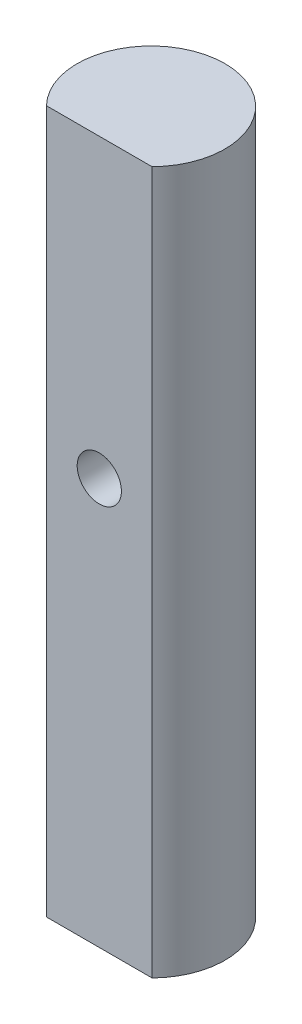
ISO-10303-21;
HEADER;
FILE_DESCRIPTION(('STEP AP214'),'2;1');
FILE_NAME('part.step','',(''),(''),'','','');
FILE_SCHEMA(('AUTOMOTIVE_DESIGN { 1 0 10303 214 1 1 1 1 }'));
ENDSEC;
DATA;
#1=APPLICATION_CONTEXT('core data for automotive mechanical design processes');
#2=APPLICATION_PROTOCOL_DEFINITION('international standard','automotive_design',2000,#1);
#3=PRODUCT_CONTEXT('',#1,'mechanical');
#4=PRODUCT('Part','Part','',(#3));
#5=PRODUCT_RELATED_PRODUCT_CATEGORY('part','',(#4));
#6=PRODUCT_DEFINITION_FORMATION('','',#4);
#7=PRODUCT_DEFINITION_CONTEXT('part definition',#1,'design');
#8=PRODUCT_DEFINITION('design','',#6,#7);
#9=PRODUCT_DEFINITION_SHAPE('','',#8);
#10=(LENGTH_UNIT() NAMED_UNIT(*) SI_UNIT(.MILLI.,.METRE.));
#11=(NAMED_UNIT(*) PLANE_ANGLE_UNIT() SI_UNIT($,.RADIAN.));
#12=(NAMED_UNIT(*) SI_UNIT($,.STERADIAN.) SOLID_ANGLE_UNIT());
#13=UNCERTAINTY_MEASURE_WITH_UNIT(LENGTH_MEASURE(1.E-05),#10,'distance_accuracy_value','');
#14=(GEOMETRIC_REPRESENTATION_CONTEXT(3) GLOBAL_UNCERTAINTY_ASSIGNED_CONTEXT((#13)) GLOBAL_UNIT_ASSIGNED_CONTEXT((#10,
#11,#12)) REPRESENTATION_CONTEXT('',''));
#15=CARTESIAN_POINT('',(0.,0.,0.));
#16=DIRECTION('',(0.,0.,1.));
#17=DIRECTION('',(1.,0.,0.));
#18=AXIS2_PLACEMENT_3D('',#15,#16,#17);
#19=CARTESIAN_POINT('',(0.,60.32492963,0.));
#20=DIRECTION('',(0.,-1.,0.));
#21=DIRECTION('',(0.,0.,-1.));
#22=AXIS2_PLACEMENT_3D('',#19,#20,#21);
#23=CYLINDRICAL_SURFACE('',#22,6.35);
#24=CARTESIAN_POINT('',(0.,32.979404704,-6.3500000000003));
#25=CARTESIAN_POINT('',(0.10417423007137,32.9794060100568,-6.34999907745002));
#26=CARTESIAN_POINT('',(0.208361677234869,32.9880068124391,-6.34741194322595));
#27=CARTESIAN_POINT('',(0.413703564897641,33.0221017775473,-6.33734405929361));
#28=CARTESIAN_POINT('',(0.514857073747792,33.0476010749863,-6.32986182218663));
#29=CARTESIAN_POINT('',(0.711139592873179,33.1145662800004,-6.31082376723533));
#30=CARTESIAN_POINT('',(0.806277218635493,33.1560087230154,-6.29927393803215));
#31=CARTESIAN_POINT('',(0.988253187796907,33.2535878862995,-6.27330179744045));
#32=CARTESIAN_POINT('',(1.07509044153309,33.3097265322616,-6.25887910967084));
#33=CARTESIAN_POINT('',(1.24047891030717,33.4367927285918,-6.22823999433316));
#34=CARTESIAN_POINT('',(1.3187597983693,33.508063294062,-6.21198699198934));
#35=CARTESIAN_POINT('',(1.46245535318964,33.6626390721746,-6.17973775823127));
#36=CARTESIAN_POINT('',(1.52786787234963,33.7459462895933,-6.16374157008507));
#37=CARTESIAN_POINT('',(1.64538908787594,33.9245138356212,-6.13343056671381));
#38=CARTESIAN_POINT('',(1.69716842823096,34.0199993678275,-6.11916122325647));
#39=CARTESIAN_POINT('',(1.78382461525216,34.218818135287,-6.09446589742613));
#40=CARTESIAN_POINT('',(1.81870549028692,34.3221494933993,-6.08403899920748));
#41=CARTESIAN_POINT('',(1.86960095013749,34.5306924475155,-6.06859017174986));
#42=CARTESIAN_POINT('',(1.88611365020934,34.6357716484882,-6.06342587458966));
#43=CARTESIAN_POINT('',(1.90135937321492,34.8473260572609,-6.05866338815991));
#44=CARTESIAN_POINT('',(1.90009667171744,34.9538009232016,-6.05906386037997));
#45=CARTESIAN_POINT('',(1.88021881579598,35.1610787639443,-6.06525944714982));
#46=CARTESIAN_POINT('',(1.86222702847388,35.2619482704934,-6.07086075515797));
#47=CARTESIAN_POINT('',(1.81040860261061,35.4591662213698,-6.08651344917327));
#48=CARTESIAN_POINT('',(1.77658041070945,35.5555142211715,-6.09656527171689));
#49=CARTESIAN_POINT('',(1.69358876358904,35.742482075175,-6.12014156612633));
#50=CARTESIAN_POINT('',(1.64422262512323,35.8330059855995,-6.13371149128894));
#51=CARTESIAN_POINT('',(1.53169729719298,36.0046941457619,-6.16277307320922));
#52=CARTESIAN_POINT('',(1.46853478416468,36.0858561329891,-6.17826519263676));
#53=CARTESIAN_POINT('',(1.3271108490196,36.2400530002879,-6.210212245628));
#54=CARTESIAN_POINT('',(1.24833191932304,36.3126112997898,-6.22668046499809));
#55=CARTESIAN_POINT('',(1.07951936513868,36.4435973878104,-6.25815467195813));
#56=CARTESIAN_POINT('',(0.989485042148457,36.5020242986834,-6.27316056869434));
#57=CARTESIAN_POINT('',(0.799855333702399,36.6033758932695,-6.30015487523226));
#58=CARTESIAN_POINT('',(0.700200638080896,36.646195466326,-6.31212266638949));
#59=CARTESIAN_POINT('',(0.494663437454937,36.7143261177821,-6.33154372644205));
#60=CARTESIAN_POINT('',(0.388782666341637,36.7396420459261,-6.33899824576079));
#61=CARTESIAN_POINT('',(0.177850894597567,36.7712547791772,-6.34835533637998));
#62=CARTESIAN_POINT('',(0.072904922643046,36.7781975534776,-6.35044639318698));
#63=CARTESIAN_POINT('',(-0.136659129006903,36.7746766210019,-6.34939358227364));
#64=CARTESIAN_POINT('',(-0.241277250313168,36.7642152209017,-6.34625040827613));
#65=CARTESIAN_POINT('',(-0.444781942193918,36.7267054746515,-6.33520564342841));
#66=CARTESIAN_POINT('',(-0.543744413662504,36.7000340452288,-6.32741225271153));
#67=CARTESIAN_POINT('',(-0.735768622856867,36.6313143310468,-6.30796848523179));
#68=CARTESIAN_POINT('',(-0.828829651453892,36.589264202446,-6.29631764599294));
#69=CARTESIAN_POINT('',(-1.00879032004296,36.489892852508,-6.27003255890797));
#70=CARTESIAN_POINT('',(-1.09549867740114,36.4322422046762,-6.25533577597258));
#71=CARTESIAN_POINT('',(-1.25823067273906,36.3037070377544,-6.22464652181085));
#72=CARTESIAN_POINT('',(-1.3342516416571,36.2328192230775,-6.20865372848617));
#73=CARTESIAN_POINT('',(-1.47629145056279,36.0767875055954,-6.17645243900758));
#74=CARTESIAN_POINT('',(-1.54185080419523,35.9912217303141,-6.16025695785637));
#75=CARTESIAN_POINT('',(-1.65771183079171,35.8099515483067,-6.13009694049586));
#76=CARTESIAN_POINT('',(-1.70801391463707,35.7142474147024,-6.11613234421318));
#77=CARTESIAN_POINT('',(-1.79158652861863,35.5157291279489,-6.09217616531609));
#78=CARTESIAN_POINT('',(-1.82493730082877,35.4129511379582,-6.08216591527265));
#79=CARTESIAN_POINT('',(-1.87375981206238,35.2028832044675,-6.06730484103379));
#80=CARTESIAN_POINT('',(-1.88923762630833,35.0955948069657,-6.06245226373115));
#81=CARTESIAN_POINT('',(-1.90146374813229,34.8843226866514,-6.05862786351896));
#82=CARTESIAN_POINT('',(-1.89896073312194,34.7803859757344,-6.05942095598867));
#83=CARTESIAN_POINT('',(-1.87708175514671,34.5744873211649,-6.06623379445759));
#84=CARTESIAN_POINT('',(-1.85770645947701,34.4725252995768,-6.07225333375188));
#85=CARTESIAN_POINT('',(-1.80311475679839,34.2746853061407,-6.08868365405119));
#86=CARTESIAN_POINT('',(-1.76809533443216,34.1787481001893,-6.0990397324944));
#87=CARTESIAN_POINT('',(-1.68336272312535,33.9940342510198,-6.12296653822527));
#88=CARTESIAN_POINT('',(-1.6336467363105,33.9052589753618,-6.13653787752392));
#89=CARTESIAN_POINT('',(-1.51882382377394,33.733911582476,-6.16597947053966));
#90=CARTESIAN_POINT('',(-1.45322474564031,33.6516805152098,-6.18191517730378));
#91=CARTESIAN_POINT('',(-1.30938518586601,33.4991508542522,-6.21397068703907));
#92=CARTESIAN_POINT('',(-1.23114143189495,33.428855359064,-6.23009053665855));
#93=CARTESIAN_POINT('',(-1.0615029927584,33.3001633808807,-6.26125794809995));
#94=CARTESIAN_POINT('',(-0.969792965367141,33.2421706579669,-6.27626091077484));
#95=CARTESIAN_POINT('',(-0.77747577803463,33.1425088992376,-6.30297006599699));
#96=CARTESIAN_POINT('',(-0.676872858099815,33.1008321351115,-6.3146778186319));
#97=CARTESIAN_POINT('',(-0.480946828717826,33.0387762401612,-6.3324396356006));
#98=CARTESIAN_POINT('',(-0.38624193432698,33.0165719658805,-6.33897056340221));
#99=CARTESIAN_POINT('',(-0.194361588258408,32.9868868001475,-6.34775082360896));
#100=CARTESIAN_POINT('',(-0.0971865458476243,32.9794034855494,-6.35000086066877));
#101=CARTESIAN_POINT('',(0.,32.979404704,-6.3500000000003));
#102=B_SPLINE_CURVE_WITH_KNOTS('',3,(#24,#25,#26,#27,#28,#29,#30,#31,#32,#33,#34,#35,#36,#37,
#38,#39,#40,#41,#42,#43,#44,#45,#46,#47,#48,#49,#50,#51,#52,#53,#54,#55,#56,#57,#58,#59,#60,#61,
#62,#63,#64,#65,#66,#67,#68,#69,#70,#71,#72,#73,#74,#75,#76,#77,#78,#79,#80,#81,#82,#83,#84,#85,
#86,#87,#88,#89,#90,#91,#92,#93,#94,#95,#96,#97,#98,#99,#100,#101),.UNSPECIFIED.,.T.,.F.,(4,2,2,
2,2,2,2,2,2,2,2,2,2,2,2,2,2,2,2,2,2,2,2,2,2,2,2,2,2,2,2,2,2,2,2,2,2,2,4),(0.,0.312165720584856,
0.624426338188596,0.936229129018963,1.24807279688995,1.56793135194628,1.88784324289997,
2.21489216211498,2.54186307882267,2.85973281175923,3.1775260878756,3.48393269114427,
3.7903693554985,4.10098164824079,4.41166885056055,4.73523962855109,5.05883049711224,
5.38456205379575,5.71020332365662,6.024233362758,6.33822178495756,6.64517465691199,
6.95216434329719,7.26622482669836,7.5803636045641,7.90582936913737,8.23128636807431,
8.55518806464502,8.87897963089215,9.18936986001778,9.49974781383185,9.80632319022189,
10.1129569688578,10.4306947974601,10.7485149858714,11.0755434088709,11.4024167417515,
11.6936913033873,11.9849179157164),.UNSPECIFIED.);
#103=CARTESIAN_POINT('',(0.,32.979404704,-6.3500000000003));
#104=VERTEX_POINT('',#103);
#105=EDGE_CURVE('E13',#104,#104,#102,.T.);
#106=ORIENTED_EDGE('',*,*,#105,.T.);
#107=EDGE_LOOP('',(#106));
#108=FACE_BOUND('',#107,.T.);
#109=CARTESIAN_POINT('',(0.,60.32492963,0.));
#110=DIRECTION('',(0.,1.,0.));
#111=DIRECTION('',(0.,0.,1.));
#112=AXIS2_PLACEMENT_3D('',#109,#110,#111);
#113=CIRCLE('',#112,6.35);
#114=CARTESIAN_POINT('',(4.53480705212471,60.32492963,4.44499999999959));
#115=VERTEX_POINT('',#114);
#116=CARTESIAN_POINT('',(-4.53480705212471,60.32492963,4.44499999999959));
#117=VERTEX_POINT('',#116);
#118=EDGE_CURVE('E86',#115,#117,#113,.T.);
#119=ORIENTED_EDGE('',*,*,#118,.F.);
#120=DIRECTION('',(0.,-1.,0.));
#121=VECTOR('',#120,1.);
#122=CARTESIAN_POINT('',(4.53480705212471,60.32492963,4.44499999999959));
#123=LINE('',#122,#121);
#124=CARTESIAN_POINT('',(4.53480705212471,0.,4.44499999999959));
#125=VERTEX_POINT('',#124);
#126=EDGE_CURVE('E73',#115,#125,#123,.T.);
#127=ORIENTED_EDGE('',*,*,#126,.T.);
#128=CARTESIAN_POINT('',(0.,0.,0.));
#129=DIRECTION('',(0.,1.,0.));
#130=DIRECTION('',(0.,0.,1.));
#131=AXIS2_PLACEMENT_3D('',#128,#129,#130);
#132=CIRCLE('',#131,6.35);
#133=CARTESIAN_POINT('',(-4.53480705212471,0.,4.44499999999959));
#134=VERTEX_POINT('',#133);
#135=EDGE_CURVE('E81',#125,#134,#132,.T.);
#136=ORIENTED_EDGE('',*,*,#135,.T.);
#137=DIRECTION('',(0.,-1.,0.));
#138=VECTOR('',#137,1.);
#139=CARTESIAN_POINT('',(-4.53480705212471,60.32492963,4.44499999999959));
#140=LINE('',#139,#138);
#141=EDGE_CURVE('E65',#134,#117,#140,.F.);
#142=ORIENTED_EDGE('',*,*,#141,.T.);
#143=EDGE_LOOP('',(#119,#127,#136,#142));
#144=FACE_BOUND('',#143,.T.);
#145=ADVANCED_FACE('F47',(#108,#144),#23,.T.);
#146=CARTESIAN_POINT('',(0.,60.32492963,0.));
#147=DIRECTION('',(0.,1.,0.));
#148=DIRECTION('',(0.,0.,1.));
#149=AXIS2_PLACEMENT_3D('',#146,#147,#148);
#150=PLANE('',#149);
#151=DIRECTION('',(-1.,0.,0.));
#152=VECTOR('',#151,1.);
#153=CARTESIAN_POINT('',(0.,60.32492963,4.44499999999959));
#154=LINE('',#153,#152);
#155=EDGE_CURVE('E76',#115,#117,#154,.T.);
#156=ORIENTED_EDGE('',*,*,#155,.F.);
#157=ORIENTED_EDGE('',*,*,#118,.T.);
#158=EDGE_LOOP('',(#156,#157));
#159=FACE_BOUND('',#158,.T.);
#160=ADVANCED_FACE('F85',(#159),#150,.T.);
#161=CARTESIAN_POINT('',(0.,0.,0.));
#162=DIRECTION('',(0.,1.,0.));
#163=DIRECTION('',(0.,0.,1.));
#164=AXIS2_PLACEMENT_3D('',#161,#162,#163);
#165=PLANE('',#164);
#166=ORIENTED_EDGE('',*,*,#135,.F.);
#167=DIRECTION('',(-1.,0.,0.));
#168=VECTOR('',#167,1.);
#169=CARTESIAN_POINT('',(0.,0.,4.44499999999959));
#170=LINE('',#169,#168);
#171=EDGE_CURVE('E58',#125,#134,#170,.T.);
#172=ORIENTED_EDGE('',*,*,#171,.T.);
#173=EDGE_LOOP('',(#166,#172));
#174=FACE_BOUND('',#173,.T.);
#175=ADVANCED_FACE('F100',(#174),#165,.F.);
#176=CARTESIAN_POINT('',(0.,0.,4.44499999999959));
#177=DIRECTION('',(0.,0.,-1.));
#178=DIRECTION('',(-1.,0.,0.));
#179=AXIS2_PLACEMENT_3D('',#176,#177,#178);
#180=PLANE('',#179);
#181=CARTESIAN_POINT('',(0.,34.878054704,4.44499999999959));
#182=DIRECTION('',(0.,0.,1.));
#183=DIRECTION('',(1.,0.,0.));
#184=AXIS2_PLACEMENT_3D('',#181,#182,#183);
#185=CIRCLE('',#184,1.89865);
#186=CARTESIAN_POINT('',(1.89865,34.878054704,4.44499999999959));
#187=VERTEX_POINT('',#186);
#188=EDGE_CURVE('E87',#187,#187,#185,.T.);
#189=ORIENTED_EDGE('',*,*,#188,.F.);
#190=EDGE_LOOP('',(#189));
#191=FACE_BOUND('',#190,.T.);
#192=ORIENTED_EDGE('',*,*,#155,.T.);
#193=ORIENTED_EDGE('',*,*,#141,.F.);
#194=ORIENTED_EDGE('',*,*,#171,.F.);
#195=ORIENTED_EDGE('',*,*,#126,.F.);
#196=EDGE_LOOP('',(#192,#193,#194,#195));
#197=FACE_BOUND('',#196,.T.);
#198=ADVANCED_FACE('F75',(#191,#197),#180,.F.);
#199=CARTESIAN_POINT('',(0.,34.878054704,4.44499999999959));
#200=DIRECTION('',(0.,0.,1.));
#201=DIRECTION('',(1.,0.,0.));
#202=AXIS2_PLACEMENT_3D('',#199,#200,#201);
#203=CYLINDRICAL_SURFACE('',#202,1.89865);
#204=ORIENTED_EDGE('',*,*,#188,.T.);
#205=EDGE_LOOP('',(#204));
#206=FACE_BOUND('',#205,.T.);
#207=ORIENTED_EDGE('',*,*,#105,.F.);
#208=EDGE_LOOP('',(#207));
#209=FACE_BOUND('',#208,.T.);
#210=ADVANCED_FACE('F96',(#206,#209),#203,.F.);
#211=CLOSED_SHELL('',(#145,#160,#175,#198,#210));
#212=MANIFOLD_SOLID_BREP('B2',#211);
#213=ADVANCED_BREP_SHAPE_REPRESENTATION('',(#18,#212),#14);
#214=SHAPE_DEFINITION_REPRESENTATION(#9,#213);
ENDSEC;
END-ISO-10303-21;
